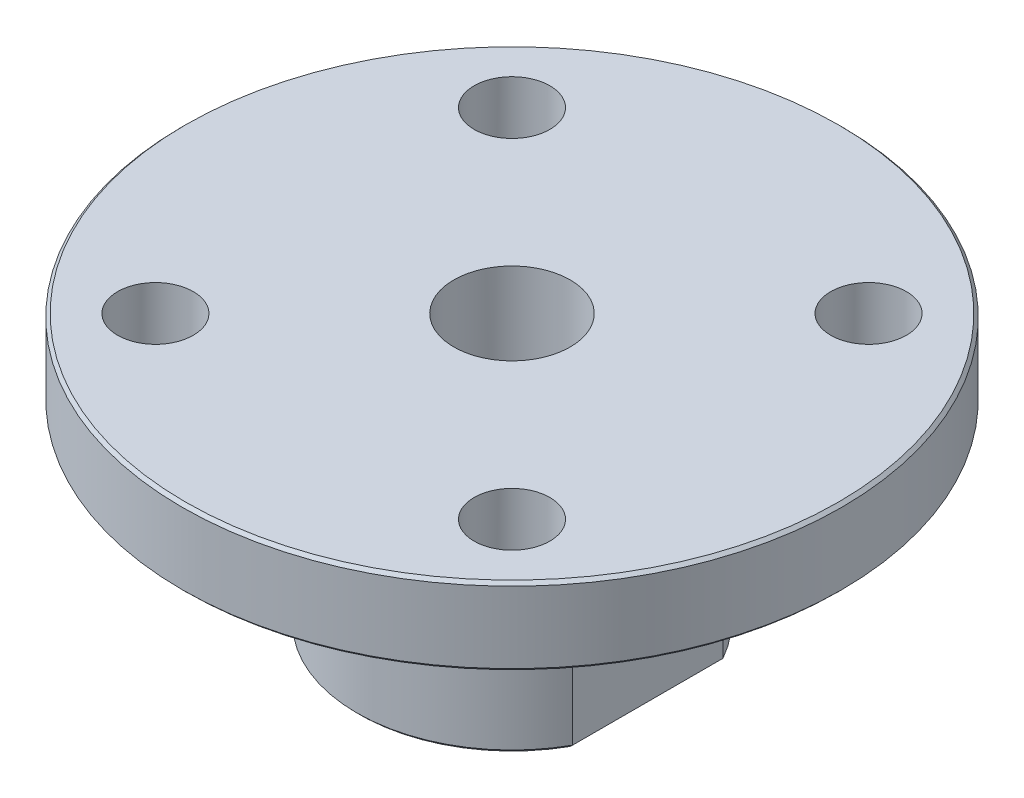
ISO-10303-21;
HEADER;
FILE_DESCRIPTION(('STEP AP214'),'2;1');
FILE_NAME('part.step','',(''),(''),'','','');
FILE_SCHEMA(('AUTOMOTIVE_DESIGN { 1 0 10303 214 1 1 1 1 }'));
ENDSEC;
DATA;
#1=APPLICATION_CONTEXT('core data for automotive mechanical design processes');
#2=APPLICATION_PROTOCOL_DEFINITION('international standard','automotive_design',2000,#1);
#3=PRODUCT_CONTEXT('',#1,'mechanical');
#4=PRODUCT('Part','Part','',(#3));
#5=PRODUCT_RELATED_PRODUCT_CATEGORY('part','',(#4));
#6=PRODUCT_DEFINITION_FORMATION('','',#4);
#7=PRODUCT_DEFINITION_CONTEXT('part definition',#1,'design');
#8=PRODUCT_DEFINITION('design','',#6,#7);
#9=PRODUCT_DEFINITION_SHAPE('','',#8);
#10=(LENGTH_UNIT() NAMED_UNIT(*) SI_UNIT(.MILLI.,.METRE.));
#11=(NAMED_UNIT(*) PLANE_ANGLE_UNIT() SI_UNIT($,.RADIAN.));
#12=(NAMED_UNIT(*) SI_UNIT($,.STERADIAN.) SOLID_ANGLE_UNIT());
#13=UNCERTAINTY_MEASURE_WITH_UNIT(LENGTH_MEASURE(1.E-05),#10,'distance_accuracy_value','');
#14=(GEOMETRIC_REPRESENTATION_CONTEXT(3) GLOBAL_UNCERTAINTY_ASSIGNED_CONTEXT((#13)) GLOBAL_UNIT_ASSIGNED_CONTEXT((#10,
#11,#12)) REPRESENTATION_CONTEXT('',''));
#15=CARTESIAN_POINT('',(0.,0.,0.));
#16=DIRECTION('',(0.,0.,1.));
#17=DIRECTION('',(1.,0.,0.));
#18=AXIS2_PLACEMENT_3D('',#15,#16,#17);
#19=CARTESIAN_POINT('',(-0.0198817220532782,-3.8664891042179,5.31383670073567E-07));
#20=DIRECTION('',(0.,-1.,0.));
#21=DIRECTION('',(0.,0.,-1.));
#22=AXIS2_PLACEMENT_3D('',#19,#20,#21);
#23=CYLINDRICAL_SURFACE('',#22,9.525);
#24=DIRECTION('',(0.,-1.,0.));
#25=VECTOR('',#24,1.);
#26=CARTESIAN_POINT('',(8.31449327794672,17.5647608957821,-4.61127026519453));
#27=LINE('',#26,#25);
#28=CARTESIAN_POINT('',(8.31449327794672,8.0397608957821,-4.61127026519454));
#29=VERTEX_POINT('',#28);
#30=CARTESIAN_POINT('',(8.31449327794672,-3.6759891042179,-4.61127026519453));
#31=VERTEX_POINT('',#30);
#32=EDGE_CURVE('E106',#29,#31,#27,.T.);
#33=ORIENTED_EDGE('',*,*,#32,.T.);
#34=CARTESIAN_POINT('',(-0.0198817220532782,-3.6759891042179,5.31383670073567E-07));
#35=DIRECTION('',(0.,-1.,0.));
#36=DIRECTION('',(0.,0.,-1.));
#37=AXIS2_PLACEMENT_3D('',#34,#35,#36);
#38=CIRCLE('',#37,9.525);
#39=CARTESIAN_POINT('',(-8.35425672205328,-3.6759891042179,-4.61127026519453));
#40=VERTEX_POINT('',#39);
#41=EDGE_CURVE('E59',#31,#40,#38,.F.);
#42=ORIENTED_EDGE('',*,*,#41,.T.);
#43=DIRECTION('',(0.,-1.,0.));
#44=VECTOR('',#43,1.);
#45=CARTESIAN_POINT('',(-8.35425672205328,17.5647608957821,-4.61127026519453));
#46=LINE('',#45,#44);
#47=CARTESIAN_POINT('',(-8.35425672205328,8.0397608957821,-4.61127026519453));
#48=VERTEX_POINT('',#47);
#49=EDGE_CURVE('E126',#48,#40,#46,.T.);
#50=ORIENTED_EDGE('',*,*,#49,.F.);
#51=CARTESIAN_POINT('',(-0.0198817220532782,8.0397608957821,5.31383670073567E-07));
#52=DIRECTION('',(0.,-1.,0.));
#53=DIRECTION('',(0.,0.,-1.));
#54=AXIS2_PLACEMENT_3D('',#51,#52,#53);
#55=CIRCLE('',#54,9.525);
#56=EDGE_CURVE('E123',#48,#29,#55,.T.);
#57=ORIENTED_EDGE('',*,*,#56,.T.);
#58=EDGE_LOOP('',(#33,#42,#50,#57));
#59=FACE_BOUND('',#58,.T.);
#60=ADVANCED_FACE('F37',(#59),#23,.T.);
#61=CARTESIAN_POINT('',(9.50511827794672,-3.8664891042179,5.31383670073567E-07));
#62=DIRECTION('',(0.,-1.,0.));
#63=DIRECTION('',(0.,0.,-1.));
#64=AXIS2_PLACEMENT_3D('',#61,#62,#63);
#65=PLANE('',#64);
#66=CARTESIAN_POINT('',(-0.0198817220532782,-3.8664891042179,5.31383670073567E-07));
#67=DIRECTION('',(0.,-1.,0.));
#68=DIRECTION('',(0.,0.,-1.));
#69=AXIS2_PLACEMENT_3D('',#66,#67,#68);
#70=CIRCLE('',#69,9.33450000000001);
#71=CARTESIAN_POINT('',(-8.16375672205328,-3.8664891042179,-4.5618182105629));
#72=VERTEX_POINT('',#71);
#73=CARTESIAN_POINT('',(8.12399327794673,-3.8664891042179,-4.5618182105629));
#74=VERTEX_POINT('',#73);
#75=EDGE_CURVE('E157',#72,#74,#70,.T.);
#76=ORIENTED_EDGE('',*,*,#75,.T.);
#77=DIRECTION('',(0.,0.,1.));
#78=VECTOR('',#77,1.);
#79=CARTESIAN_POINT('',(8.12399327794673,-3.8664891042179,4.61127132796188));
#80=LINE('',#79,#78);
#81=CARTESIAN_POINT('',(8.12399327794673,-3.8664891042179,4.56181927333024));
#82=VERTEX_POINT('',#81);
#83=EDGE_CURVE('E163',#74,#82,#80,.T.);
#84=ORIENTED_EDGE('',*,*,#83,.T.);
#85=CARTESIAN_POINT('',(-0.0198817220532782,-3.8664891042179,5.31383670073567E-07));
#86=DIRECTION('',(0.,-1.,0.));
#87=DIRECTION('',(0.,0.,-1.));
#88=AXIS2_PLACEMENT_3D('',#85,#86,#87);
#89=CIRCLE('',#88,9.33450000000001);
#90=CARTESIAN_POINT('',(-8.16375672205328,-3.8664891042179,4.56181927333024));
#91=VERTEX_POINT('',#90);
#92=EDGE_CURVE('E161',#82,#91,#89,.T.);
#93=ORIENTED_EDGE('',*,*,#92,.T.);
#94=DIRECTION('',(0.,0.,-1.));
#95=VECTOR('',#94,1.);
#96=CARTESIAN_POINT('',(-8.16375672205328,-3.8664891042179,-4.61127026519453));
#97=LINE('',#96,#95);
#98=EDGE_CURVE('E159',#91,#72,#97,.T.);
#99=ORIENTED_EDGE('',*,*,#98,.T.);
#100=EDGE_LOOP('',(#76,#84,#93,#99));
#101=FACE_BOUND('',#100,.T.);
#102=CARTESIAN_POINT('',(-0.0198817220532782,-3.8664891042179,5.31383670073567E-07));
#103=DIRECTION('',(0.,-1.,0.));
#104=DIRECTION('',(0.,0.,-1.));
#105=AXIS2_PLACEMENT_3D('',#102,#103,#104);
#106=CIRCLE('',#105,3.571875);
#107=CARTESIAN_POINT('',(-0.0198817220532782,-3.8664891042179,-3.57187446861633));
#108=VERTEX_POINT('',#107);
#109=EDGE_CURVE('E133',#108,#108,#106,.T.);
#110=ORIENTED_EDGE('',*,*,#109,.F.);
#111=EDGE_LOOP('',(#110));
#112=FACE_BOUND('',#111,.T.);
#113=ADVANCED_FACE('F224',(#101,#112),#65,.T.);
#114=CARTESIAN_POINT('',(-0.0198817220532782,-3.8664891042179,5.31383670073567E-07));
#115=DIRECTION('',(0.,-1.,0.));
#116=DIRECTION('',(0.,0.,-1.));
#117=AXIS2_PLACEMENT_3D('',#114,#115,#116);
#118=CYLINDRICAL_SURFACE('',#117,3.571875);
#119=CARTESIAN_POINT('',(-2.73146170715883,3.2772608957821,-2.32499946861633));
#120=CARTESIAN_POINT('',(-2.7314775624167,3.3915795025591,-2.32499003055001));
#121=CARTESIAN_POINT('',(-2.73882493715926,3.50597022268737,-2.31649511386127));
#122=CARTESIAN_POINT('',(-2.76683538108933,3.73072819000853,-2.28319242976851));
#123=CARTESIAN_POINT('',(-2.78752287192214,3.84108766490796,-2.25835474207934));
#124=CARTESIAN_POINT('',(-2.8386039395818,4.05387877141388,-2.1942511721876));
#125=CARTESIAN_POINT('',(-2.86890822049158,4.15637297089722,-2.1551175473839));
#126=CARTESIAN_POINT('',(-2.93565193970546,4.35319795649541,-2.06391953658588));
#127=CARTESIAN_POINT('',(-2.97209274242278,4.447526920049,-2.01185227366062));
#128=CARTESIAN_POINT('',(-3.0534466715899,4.64056871836579,-1.88734533935964));
#129=CARTESIAN_POINT('',(-3.09881739174505,4.73788358807819,-1.81303517137026));
#130=CARTESIAN_POINT('',(-3.18919680070623,4.91985803352869,-1.64998653998349));
#131=CARTESIAN_POINT('',(-3.23420512056504,5.00450595676177,-1.56123494644712));
#132=CARTESIAN_POINT('',(-3.32598720345202,5.17015479941209,-1.35721479349088));
#133=CARTESIAN_POINT('',(-3.37217858469218,5.2491195423414,-1.23998383345868));
#134=CARTESIAN_POINT('',(-3.4336704450067,5.35139067128632,-1.05293722386762));
#135=CARTESIAN_POINT('',(-3.45287270934683,5.3827914157772,-0.988702581182095));
#136=CARTESIAN_POINT('',(-3.48811761396113,5.43978243378651,-0.856894266052433));
#137=CARTESIAN_POINT('',(-3.50416253951705,5.46537691194643,-0.789323053261652));
#138=CARTESIAN_POINT('',(-3.53103517812485,5.50790493767738,-0.658819505412244));
#139=CARTESIAN_POINT('',(-3.54223860215931,5.52547425911578,-0.596170930228988));
#140=CARTESIAN_POINT('',(-3.5613900429483,5.55536253639776,-0.46917888250122));
#141=CARTESIAN_POINT('',(-3.56934001233527,5.5676846416543,-0.404836451316687));
#142=CARTESIAN_POINT('',(-3.58174662469287,5.58686470236922,-0.275049628485655));
#143=CARTESIAN_POINT('',(-3.58620575545805,5.59372654921403,-0.209606055621842));
#144=CARTESIAN_POINT('',(-3.59150571159487,5.60187678832828,-0.078250627117506));
#145=CARTESIAN_POINT('',(-3.59234700979559,5.60316590891984,-0.0123388337985067));
#146=CARTESIAN_POINT('',(-3.58966337349005,5.59904791957824,0.165959354426146));
#147=CARTESIAN_POINT('',(-3.5826279370355,5.58825752714634,0.278231652061616));
#148=CARTESIAN_POINT('',(-3.55848924438826,5.55086466561955,0.498904640997477));
#149=CARTESIAN_POINT('',(-3.54138523947942,5.52426102062245,0.607305043741169));
#150=CARTESIAN_POINT('',(-3.49860096055752,5.45659724404411,0.817492651067283));
#151=CARTESIAN_POINT('',(-3.47293201216006,5.41555619948858,0.919288377948152));
#152=CARTESIAN_POINT('',(-3.41493962694044,5.3205827178036,1.11457064949462));
#153=CARTESIAN_POINT('',(-3.38261487253598,5.26664772784979,1.2080555436948));
#154=CARTESIAN_POINT('',(-3.30898296196476,5.13966306189124,1.39701993702971));
#155=CARTESIAN_POINT('',(-3.2670550011657,5.06504519598542,1.49120136622184));
#156=CARTESIAN_POINT('',(-3.18066485673093,4.90286806525612,1.66652969479193));
#157=CARTESIAN_POINT('',(-3.13619888058189,4.81528910447443,1.74765635720306));
#158=CARTESIAN_POINT('',(-3.04190156088801,4.61476266093576,1.9066757096577));
#159=CARTESIAN_POINT('',(-2.99223458157571,4.4999782036633,1.98236739924084));
#160=CARTESIAN_POINT('',(-2.90066153683479,4.25647418124092,2.11324129922088));
#161=CARTESIAN_POINT('',(-2.85874183131543,4.12777975216982,2.1684597313779));
#162=CARTESIAN_POINT('',(-2.79961944839022,3.89619499905228,2.24342836100646));
#163=CARTESIAN_POINT('',(-2.77878603419455,3.79604932547118,2.26876830141193));
#164=CARTESIAN_POINT('',(-2.74777937217019,3.59173825391798,2.30596425440145));
#165=CARTESIAN_POINT('',(-2.73758914730089,3.48757953327043,2.31784174364133));
#166=CARTESIAN_POINT('',(-2.72942987920154,3.27774816678446,2.32737847078233));
#167=CARTESIAN_POINT('',(-2.73150339013331,3.17207152024864,2.32498820045764));
#168=CARTESIAN_POINT('',(-2.74762514463678,2.96289267309574,2.30604638080633));
#169=CARTESIAN_POINT('',(-2.76168337550628,2.85939235982658,2.2894830204915));
#170=CARTESIAN_POINT('',(-2.7989650038435,2.66095536009888,2.24405928349386));
#171=CARTESIAN_POINT('',(-2.82184443036412,2.56584499548183,2.21565750554084));
#172=CARTESIAN_POINT('',(-2.87418201406417,2.38161517533058,2.14781155369745));
#173=CARTESIAN_POINT('',(-2.90364233897123,2.29249770645116,2.10836374018901));
#174=CARTESIAN_POINT('',(-2.97284197189282,2.10403887983035,2.01061361998227));
#175=CARTESIAN_POINT('',(-3.01346212557842,2.00615658556342,1.95012598171708));
#176=CARTESIAN_POINT('',(-3.09674173227081,1.820805351551,1.81589649313645));
#177=CARTESIAN_POINT('',(-3.13940360397706,1.73334921355113,1.7421386220648));
#178=CARTESIAN_POINT('',(-3.23171407869964,1.55382307585212,1.56655204065197));
#179=CARTESIAN_POINT('',(-3.28109674088834,1.46419762599976,1.46205462977692));
#180=CARTESIAN_POINT('',(-3.37297038010698,1.30372290656741,1.2368630698638));
#181=CARTESIAN_POINT('',(-3.41546836472491,1.23285449790467,1.11618562137854));
#182=CARTESIAN_POINT('',(-3.48165974721088,1.12489712389935,0.886412698107493));
#183=CARTESIAN_POINT('',(-3.50740995714605,1.08389932387082,0.77974764338448));
#184=CARTESIAN_POINT('',(-3.5493818550096,1.01775563326971,0.559834323275614));
#185=CARTESIAN_POINT('',(-3.56561139404612,0.992596680123771,0.446591567055515));
#186=CARTESIAN_POINT('',(-3.58709524309648,0.959393544845475,0.216133661642464));
#187=CARTESIAN_POINT('',(-3.59230852821251,0.951413334870012,0.0989053100166196));
#188=CARTESIAN_POINT('',(-3.591111903638,0.95325135178691,-0.135358380914078));
#189=CARTESIAN_POINT('',(-3.58470184430736,0.963069807821077,-0.252393717714624));
#190=CARTESIAN_POINT('',(-3.56162538265198,0.998785413582548,-0.475589150449209));
#191=CARTESIAN_POINT('',(-3.54559823257946,1.02368125021565,-0.581980204389795));
#192=CARTESIAN_POINT('',(-3.50517206459548,1.08746873259919,-0.788765599438254));
#193=CARTESIAN_POINT('',(-3.48077171388295,1.12636260653008,-0.889158982880431));
#194=CARTESIAN_POINT('',(-3.42345997911043,1.21980242020666,-1.08879046765158));
#195=CARTESIAN_POINT('',(-3.39007768181263,1.27524282288371,-1.18747140079573));
#196=CARTESIAN_POINT('',(-3.31821041560466,1.39874331133318,-1.37454686428876));
#197=CARTESIAN_POINT('',(-3.27972181946135,1.46681238163739,-1.46293399789207));
#198=CARTESIAN_POINT('',(-3.19405794981018,1.62562906159314,-1.64138429039719));
#199=CARTESIAN_POINT('',(-3.14646215264324,1.71825706756085,-1.72957406866604));
#200=CARTESIAN_POINT('',(-3.05223995479504,1.91704198499948,-1.88990530160735));
#201=CARTESIAN_POINT('',(-3.0056140527365,2.02320566452391,-1.9620386779346));
#202=CARTESIAN_POINT('',(-2.9235328197567,2.23472715468224,-2.0812765328512));
#203=CARTESIAN_POINT('',(-2.88740879912004,2.33872645012006,-2.13032179835603));
#204=CARTESIAN_POINT('',(-2.824080144694,2.55513087230911,-2.21302766732342));
#205=CARTESIAN_POINT('',(-2.79685449587449,2.66751541272667,-2.24672459376489));
#206=CARTESIAN_POINT('',(-2.76174218999931,2.8632689142691,-2.28932353559164));
#207=CARTESIAN_POINT('',(-2.75049329365705,2.94508273097013,-2.30264794277704));
#208=CARTESIAN_POINT('',(-2.73534811247472,3.11033876593768,-2.3204883378288));
#209=CARTESIAN_POINT('',(-2.73145012897747,3.19378060349541,-2.32500636069241));
#210=CARTESIAN_POINT('',(-2.73146170715883,3.2772608957821,-2.32499946861633));
#211=B_SPLINE_CURVE_WITH_KNOTS('',3,(#119,#120,#121,#122,#123,#124,#125,#126,#127,#128,#129,
#130,#131,#132,#133,#134,#135,#136,#137,#138,#139,#140,#141,#142,#143,#144,#145,#146,#147,#148,
#149,#150,#151,#152,#153,#154,#155,#156,#157,#158,#159,#160,#161,#162,#163,#164,#165,#166,#167,
#168,#169,#170,#171,#172,#173,#174,#175,#176,#177,#178,#179,#180,#181,#182,#183,#184,#185,#186,
#187,#188,#189,#190,#191,#192,#193,#194,#195,#196,#197,#198,#199,#200,#201,#202,#203,#204,#205,
#206,#207,#208,#209,#210),.UNSPECIFIED.,.T.,.F.,(4,2,2,2,2,2,2,2,2,2,2,2,2,2,2,2,2,2,2,2,2,2,2,
2,2,2,2,2,2,2,2,2,2,2,2,2,2,2,2,2,2,2,2,2,2,4),(0.,0.342577058786246,0.68578305805359,
1.02589116412076,1.36607499096276,1.75632465391691,2.14693113490703,2.59028603394016,
2.81208469072516,3.03372221433681,3.2314985676722,3.42915604647737,3.62667253337827,
3.82416320527059,4.1613883096566,4.49863849385254,4.83544448034078,5.17231720510119,
5.55264181918894,5.93355043282716,6.37006526010087,6.80580406776713,7.12067299113983,
7.43503889381593,7.75049625900399,8.06621676340994,8.37070152551469,8.67528673224584,
9.04005364496139,9.40526392151594,9.84192173126061,10.2781322565468,10.6280621664841,
10.9777031037519,11.3286438373433,11.6795890890128,12.009452307041,12.3393680552967,
12.6920365757864,13.0449569674442,13.4527124298897,13.8606725821052,14.2209094210398,
14.5802892459182,14.8305113637395,15.080675652865),.UNSPECIFIED.);
#212=CARTESIAN_POINT('',(-2.73146170715883,3.2772608957821,-2.32499946861633));
#213=VERTEX_POINT('',#212);
#214=EDGE_CURVE('E118',#213,#213,#211,.T.);
#215=ORIENTED_EDGE('',*,*,#214,.F.);
#216=EDGE_LOOP('',(#215));
#217=FACE_BOUND('',#216,.T.);
#218=ORIENTED_EDGE('',*,*,#109,.T.);
#219=EDGE_LOOP('',(#218));
#220=FACE_BOUND('',#219,.T.);
#221=CARTESIAN_POINT('',(-0.0198817220532782,12.8022608957821,5.31383670073567E-07));
#222=DIRECTION('',(0.,-1.,0.));
#223=DIRECTION('',(0.,0.,-1.));
#224=AXIS2_PLACEMENT_3D('',#221,#222,#223);
#225=CIRCLE('',#224,3.571875);
#226=CARTESIAN_POINT('',(-0.0198817220532782,12.8022608957821,-3.57187446861633));
#227=VERTEX_POINT('',#226);
#228=EDGE_CURVE('E125',#227,#227,#225,.T.);
#229=ORIENTED_EDGE('',*,*,#228,.F.);
#230=EDGE_LOOP('',(#229));
#231=FACE_BOUND('',#230,.T.);
#232=ADVANCED_FACE('F243',(#217,#220,#231),#118,.F.);
#233=CARTESIAN_POINT('',(20.2207432779467,12.8022608957821,5.31383670073567E-07));
#234=DIRECTION('',(0.,1.,0.));
#235=DIRECTION('',(0.,0.,1.));
#236=AXIS2_PLACEMENT_3D('',#233,#234,#235);
#237=PLANE('',#236);
#238=CARTESIAN_POINT('',(-0.0198817220532782,12.8022608957821,5.31383670073567E-07));
#239=DIRECTION('',(0.,1.,0.));
#240=DIRECTION('',(0.,0.,1.));
#241=AXIS2_PLACEMENT_3D('',#238,#239,#240);
#242=CIRCLE('',#241,20.050125);
#243=CARTESIAN_POINT('',(-0.0198817220532782,12.8022608957821,20.0501255313837));
#244=VERTEX_POINT('',#243);
#245=EDGE_CURVE('E11',#244,#244,#242,.T.);
#246=ORIENTED_EDGE('',*,*,#245,.T.);
#247=EDGE_LOOP('',(#246));
#248=FACE_BOUND('',#247,.T.);
#249=CARTESIAN_POINT('',(-10.964568869606,12.8022608957821,10.9446876789367));
#250=DIRECTION('',(0.,1.,0.));
#251=DIRECTION('',(0.,0.,1.));
#252=AXIS2_PLACEMENT_3D('',#249,#250,#251);
#253=CIRCLE('',#252,2.325);
#254=CARTESIAN_POINT('',(-10.964568869606,12.8022608957821,13.2696876789367));
#255=VERTEX_POINT('',#254);
#256=EDGE_CURVE('E155',#255,#255,#253,.T.);
#257=ORIENTED_EDGE('',*,*,#256,.F.);
#258=EDGE_LOOP('',(#257));
#259=FACE_BOUND('',#258,.T.);
#260=CARTESIAN_POINT('',(10.9248054255001,12.8022608957821,10.9446876789364));
#261=DIRECTION('',(0.,1.,0.));
#262=DIRECTION('',(0.,0.,1.));
#263=AXIS2_PLACEMENT_3D('',#260,#261,#262);
#264=CIRCLE('',#263,2.325);
#265=CARTESIAN_POINT('',(10.9248054255001,12.8022608957821,13.2696876789364));
#266=VERTEX_POINT('',#265);
#267=EDGE_CURVE('E151',#266,#266,#264,.T.);
#268=ORIENTED_EDGE('',*,*,#267,.F.);
#269=EDGE_LOOP('',(#268));
#270=FACE_BOUND('',#269,.T.);
#271=CARTESIAN_POINT('',(10.9248054254997,12.8022608957821,-10.9446866161697));
#272=DIRECTION('',(0.,1.,0.));
#273=DIRECTION('',(0.,0.,1.));
#274=AXIS2_PLACEMENT_3D('',#271,#272,#273);
#275=CIRCLE('',#274,2.325);
#276=CARTESIAN_POINT('',(10.9248054254997,12.8022608957821,-8.61968661616969));
#277=VERTEX_POINT('',#276);
#278=EDGE_CURVE('E147',#277,#277,#275,.T.);
#279=ORIENTED_EDGE('',*,*,#278,.F.);
#280=EDGE_LOOP('',(#279));
#281=FACE_BOUND('',#280,.T.);
#282=CARTESIAN_POINT('',(-10.9645688696063,12.8022608957821,-10.9446866161693));
#283=DIRECTION('',(0.,1.,0.));
#284=DIRECTION('',(0.,0.,1.));
#285=AXIS2_PLACEMENT_3D('',#282,#283,#284);
#286=CIRCLE('',#285,2.325);
#287=CARTESIAN_POINT('',(-10.9645688696063,12.8022608957821,-8.61968661616934));
#288=VERTEX_POINT('',#287);
#289=EDGE_CURVE('E143',#288,#288,#286,.T.);
#290=ORIENTED_EDGE('',*,*,#289,.F.);
#291=EDGE_LOOP('',(#290));
#292=FACE_BOUND('',#291,.T.);
#293=ORIENTED_EDGE('',*,*,#228,.T.);
#294=EDGE_LOOP('',(#293));
#295=FACE_BOUND('',#294,.T.);
#296=ADVANCED_FACE('F251',(#248,#259,#270,#281,#292,#295),#237,.T.);
#297=CARTESIAN_POINT('',(-0.0198817220532782,-3.8664891042179,5.31383670073567E-07));
#298=DIRECTION('',(0.,-1.,0.));
#299=DIRECTION('',(0.,0.,-1.));
#300=AXIS2_PLACEMENT_3D('',#297,#298,#299);
#301=CYLINDRICAL_SURFACE('',#300,20.240625);
#302=CARTESIAN_POINT('',(-0.0198817220532782,8.23026089578209,5.31383670073567E-07));
#303=DIRECTION('',(0.,-1.,0.));
#304=DIRECTION('',(0.,0.,-1.));
#305=AXIS2_PLACEMENT_3D('',#302,#303,#304);
#306=CIRCLE('',#305,20.240625);
#307=CARTESIAN_POINT('',(-0.0198817220532782,8.23026089578209,-20.2406244686163));
#308=VERTEX_POINT('',#307);
#309=EDGE_CURVE('E51',#308,#308,#306,.F.);
#310=ORIENTED_EDGE('',*,*,#309,.T.);
#311=EDGE_LOOP('',(#310));
#312=FACE_BOUND('',#311,.T.);
#313=CARTESIAN_POINT('',(-0.0198817220532782,12.6117608957821,5.31383670073567E-07));
#314=DIRECTION('',(0.,1.,0.));
#315=DIRECTION('',(0.,0.,1.));
#316=AXIS2_PLACEMENT_3D('',#313,#314,#315);
#317=CIRCLE('',#316,20.240625);
#318=CARTESIAN_POINT('',(-0.0198817220532782,12.6117608957821,20.2406255313837));
#319=VERTEX_POINT('',#318);
#320=EDGE_CURVE('E172',#319,#319,#317,.F.);
#321=ORIENTED_EDGE('',*,*,#320,.T.);
#322=EDGE_LOOP('',(#321));
#323=FACE_BOUND('',#322,.T.);
#324=ADVANCED_FACE('F247',(#312,#323),#301,.T.);
#325=CARTESIAN_POINT('',(9.50511827794672,8.0397608957821,5.31383670073567E-07));
#326=DIRECTION('',(0.,-1.,0.));
#327=DIRECTION('',(0.,0.,-1.));
#328=AXIS2_PLACEMENT_3D('',#325,#326,#327);
#329=PLANE('',#328);
#330=CARTESIAN_POINT('',(-0.0198817220532782,8.0397608957821,5.31383670073567E-07));
#331=DIRECTION('',(0.,-1.,0.));
#332=DIRECTION('',(0.,0.,-1.));
#333=AXIS2_PLACEMENT_3D('',#330,#331,#332);
#334=CIRCLE('',#333,20.050125);
#335=CARTESIAN_POINT('',(-0.0198817220532782,8.0397608957821,-20.0501244686163));
#336=VERTEX_POINT('',#335);
#337=EDGE_CURVE('E169',#336,#336,#334,.T.);
#338=ORIENTED_EDGE('',*,*,#337,.T.);
#339=EDGE_LOOP('',(#338));
#340=FACE_BOUND('',#339,.T.);
#341=CARTESIAN_POINT('',(-10.964568869606,8.0397608957821,10.9446876789367));
#342=DIRECTION('',(0.,-1.,0.));
#343=DIRECTION('',(0.,0.,-1.));
#344=AXIS2_PLACEMENT_3D('',#341,#342,#343);
#345=CIRCLE('',#344,2.325);
#346=CARTESIAN_POINT('',(-10.964568869606,8.0397608957821,8.61968767893672));
#347=VERTEX_POINT('',#346);
#348=EDGE_CURVE('E152',#347,#347,#345,.T.);
#349=ORIENTED_EDGE('',*,*,#348,.F.);
#350=EDGE_LOOP('',(#349));
#351=FACE_BOUND('',#350,.T.);
#352=CARTESIAN_POINT('',(10.9248054255001,8.0397608957821,10.9446876789364));
#353=DIRECTION('',(0.,-1.,0.));
#354=DIRECTION('',(0.,0.,-1.));
#355=AXIS2_PLACEMENT_3D('',#352,#353,#354);
#356=CIRCLE('',#355,2.325);
#357=CARTESIAN_POINT('',(10.9248054255001,8.0397608957821,8.61968767893637));
#358=VERTEX_POINT('',#357);
#359=EDGE_CURVE('E148',#358,#358,#356,.T.);
#360=ORIENTED_EDGE('',*,*,#359,.F.);
#361=EDGE_LOOP('',(#360));
#362=FACE_BOUND('',#361,.T.);
#363=CARTESIAN_POINT('',(10.9248054254997,8.0397608957821,-10.9446866161697));
#364=DIRECTION('',(0.,-1.,0.));
#365=DIRECTION('',(0.,0.,-1.));
#366=AXIS2_PLACEMENT_3D('',#363,#364,#365);
#367=CIRCLE('',#366,2.325);
#368=CARTESIAN_POINT('',(10.9248054254997,8.0397608957821,-13.2696866161697));
#369=VERTEX_POINT('',#368);
#370=EDGE_CURVE('E144',#369,#369,#367,.T.);
#371=ORIENTED_EDGE('',*,*,#370,.F.);
#372=EDGE_LOOP('',(#371));
#373=FACE_BOUND('',#372,.T.);
#374=CARTESIAN_POINT('',(-10.9645688696063,8.0397608957821,-10.9446866161693));
#375=DIRECTION('',(0.,-1.,0.));
#376=DIRECTION('',(0.,0.,-1.));
#377=AXIS2_PLACEMENT_3D('',#374,#375,#376);
#378=CIRCLE('',#377,2.325);
#379=CARTESIAN_POINT('',(-10.9645688696063,8.0397608957821,-13.2696866161693));
#380=VERTEX_POINT('',#379);
#381=EDGE_CURVE('E140',#380,#380,#378,.T.);
#382=ORIENTED_EDGE('',*,*,#381,.F.);
#383=EDGE_LOOP('',(#382));
#384=FACE_BOUND('',#383,.T.);
#385=DIRECTION('',(0.,0.,1.));
#386=VECTOR('',#385,1.);
#387=CARTESIAN_POINT('',(8.31449327794672,8.0397608957821,-4.61127026519453));
#388=LINE('',#387,#386);
#389=CARTESIAN_POINT('',(8.31449327794672,8.03976089578211,4.61127132796188));
#390=VERTEX_POINT('',#389);
#391=EDGE_CURVE('E100',#29,#390,#388,.T.);
#392=ORIENTED_EDGE('',*,*,#391,.F.);
#393=ORIENTED_EDGE('',*,*,#56,.F.);
#394=DIRECTION('',(0.,0.,-1.));
#395=VECTOR('',#394,1.);
#396=CARTESIAN_POINT('',(-8.35425672205328,8.0397608957821,-4.61127026519453));
#397=LINE('',#396,#395);
#398=CARTESIAN_POINT('',(-8.35425672205328,8.0397608957821,4.61127132796188));
#399=VERTEX_POINT('',#398);
#400=EDGE_CURVE('E122',#399,#48,#397,.T.);
#401=ORIENTED_EDGE('',*,*,#400,.F.);
#402=EDGE_CURVE('E115',#390,#399,#55,.T.);
#403=ORIENTED_EDGE('',*,*,#402,.F.);
#404=EDGE_LOOP('',(#392,#393,#401,#403));
#405=FACE_BOUND('',#404,.T.);
#406=ADVANCED_FACE('F121',(#340,#351,#362,#373,#384,#405),#329,.T.);
#407=DIRECTION('',(0.,-1.,0.));
#408=VECTOR('',#407,1.);
#409=CARTESIAN_POINT('',(-8.35425672205328,17.5647608957821,4.61127132796188));
#410=LINE('',#409,#408);
#411=CARTESIAN_POINT('',(-8.35425672205328,-3.6759891042179,4.61127132796188));
#412=VERTEX_POINT('',#411);
#413=EDGE_CURVE('E111',#399,#412,#410,.T.);
#414=ORIENTED_EDGE('',*,*,#413,.T.);
#415=CARTESIAN_POINT('',(-0.0198817220532782,-3.6759891042179,5.31383670073567E-07));
#416=DIRECTION('',(0.,-1.,0.));
#417=DIRECTION('',(0.,0.,-1.));
#418=AXIS2_PLACEMENT_3D('',#415,#416,#417);
#419=CIRCLE('',#418,9.525);
#420=CARTESIAN_POINT('',(8.31449327794672,-3.6759891042179,4.61127132796188));
#421=VERTEX_POINT('',#420);
#422=EDGE_CURVE('E117',#412,#421,#419,.F.);
#423=ORIENTED_EDGE('',*,*,#422,.T.);
#424=DIRECTION('',(0.,-1.,0.));
#425=VECTOR('',#424,1.);
#426=CARTESIAN_POINT('',(8.31449327794672,17.5647608957821,4.61127132796188));
#427=LINE('',#426,#425);
#428=EDGE_CURVE('E104',#390,#421,#427,.T.);
#429=ORIENTED_EDGE('',*,*,#428,.F.);
#430=ORIENTED_EDGE('',*,*,#402,.T.);
#431=EDGE_LOOP('',(#414,#423,#429,#430));
#432=FACE_BOUND('',#431,.T.);
#433=ADVANCED_FACE('F114',(#432),#23,.T.);
#434=CARTESIAN_POINT('',(-8.35425672205328,17.5647608957821,-4.61127026519453));
#435=DIRECTION('',(1.,0.,0.));
#436=DIRECTION('',(0.,0.,-1.));
#437=AXIS2_PLACEMENT_3D('',#434,#435,#436);
#438=PLANE('',#437);
#439=CARTESIAN_POINT('',(-8.35425672205328,3.2772608957821,5.31383670073567E-07));
#440=DIRECTION('',(1.,0.,0.));
#441=DIRECTION('',(0.,0.,-1.));
#442=AXIS2_PLACEMENT_3D('',#439,#440,#441);
#443=CIRCLE('',#442,2.325);
#444=CARTESIAN_POINT('',(-8.35425672205328,3.2772608957821,-2.32499946861633));
#445=VERTEX_POINT('',#444);
#446=EDGE_CURVE('E137',#445,#445,#443,.T.);
#447=ORIENTED_EDGE('',*,*,#446,.T.);
#448=EDGE_LOOP('',(#447));
#449=FACE_BOUND('',#448,.T.);
#450=ORIENTED_EDGE('',*,*,#49,.T.);
#451=DIRECTION('',(0.,0.,1.));
#452=VECTOR('',#451,1.);
#453=CARTESIAN_POINT('',(-8.35425672205328,-3.67598910421791,4.61127132796188));
#454=LINE('',#453,#452);
#455=EDGE_CURVE('E66',#40,#412,#454,.T.);
#456=ORIENTED_EDGE('',*,*,#455,.T.);
#457=ORIENTED_EDGE('',*,*,#413,.F.);
#458=ORIENTED_EDGE('',*,*,#400,.T.);
#459=EDGE_LOOP('',(#450,#456,#457,#458));
#460=FACE_BOUND('',#459,.T.);
#461=ADVANCED_FACE('F228',(#449,#460),#438,.F.);
#462=CARTESIAN_POINT('',(8.31449327794672,17.5647608957821,-4.61127026519453));
#463=DIRECTION('',(-1.,0.,0.));
#464=DIRECTION('',(0.,0.,1.));
#465=AXIS2_PLACEMENT_3D('',#462,#463,#464);
#466=PLANE('',#465);
#467=ORIENTED_EDGE('',*,*,#428,.T.);
#468=DIRECTION('',(0.,0.,-1.));
#469=VECTOR('',#468,1.);
#470=CARTESIAN_POINT('',(8.31449327794672,-3.67598910421791,-4.61127026519453));
#471=LINE('',#470,#469);
#472=EDGE_CURVE('E136',#421,#31,#471,.T.);
#473=ORIENTED_EDGE('',*,*,#472,.T.);
#474=ORIENTED_EDGE('',*,*,#32,.F.);
#475=ORIENTED_EDGE('',*,*,#391,.T.);
#476=EDGE_LOOP('',(#467,#473,#474,#475));
#477=FACE_BOUND('',#476,.T.);
#478=ADVANCED_FACE('F102',(#477),#466,.F.);
#479=CARTESIAN_POINT('',(-20.2605067220533,3.2772608957821,5.31383670073567E-07));
#480=DIRECTION('',(1.,0.,0.));
#481=DIRECTION('',(0.,0.,-1.));
#482=AXIS2_PLACEMENT_3D('',#479,#480,#481);
#483=CYLINDRICAL_SURFACE('',#482,2.325);
#484=ORIENTED_EDGE('',*,*,#214,.T.);
#485=EDGE_LOOP('',(#484));
#486=FACE_BOUND('',#485,.T.);
#487=ORIENTED_EDGE('',*,*,#446,.F.);
#488=EDGE_LOOP('',(#487));
#489=FACE_BOUND('',#488,.T.);
#490=ADVANCED_FACE('F236',(#486,#489),#483,.F.);
#491=CARTESIAN_POINT('',(-10.9645688696063,-3.8664891042179,-10.9446866161693));
#492=DIRECTION('',(0.,1.,0.));
#493=DIRECTION('',(0.,0.,1.));
#494=AXIS2_PLACEMENT_3D('',#491,#492,#493);
#495=CYLINDRICAL_SURFACE('',#494,2.325);
#496=ORIENTED_EDGE('',*,*,#381,.T.);
#497=EDGE_LOOP('',(#496));
#498=FACE_BOUND('',#497,.T.);
#499=ORIENTED_EDGE('',*,*,#289,.T.);
#500=EDGE_LOOP('',(#499));
#501=FACE_BOUND('',#500,.T.);
#502=ADVANCED_FACE('F268',(#498,#501),#495,.F.);
#503=CARTESIAN_POINT('',(10.9248054254997,-3.8664891042179,-10.9446866161697));
#504=DIRECTION('',(0.,1.,0.));
#505=DIRECTION('',(0.,0.,1.));
#506=AXIS2_PLACEMENT_3D('',#503,#504,#505);
#507=CYLINDRICAL_SURFACE('',#506,2.325);
#508=ORIENTED_EDGE('',*,*,#370,.T.);
#509=EDGE_LOOP('',(#508));
#510=FACE_BOUND('',#509,.T.);
#511=ORIENTED_EDGE('',*,*,#278,.T.);
#512=EDGE_LOOP('',(#511));
#513=FACE_BOUND('',#512,.T.);
#514=ADVANCED_FACE('F272',(#510,#513),#507,.F.);
#515=CARTESIAN_POINT('',(10.9248054255001,-3.8664891042179,10.9446876789364));
#516=DIRECTION('',(0.,1.,0.));
#517=DIRECTION('',(0.,0.,1.));
#518=AXIS2_PLACEMENT_3D('',#515,#516,#517);
#519=CYLINDRICAL_SURFACE('',#518,2.325);
#520=ORIENTED_EDGE('',*,*,#359,.T.);
#521=EDGE_LOOP('',(#520));
#522=FACE_BOUND('',#521,.T.);
#523=ORIENTED_EDGE('',*,*,#267,.T.);
#524=EDGE_LOOP('',(#523));
#525=FACE_BOUND('',#524,.T.);
#526=ADVANCED_FACE('F276',(#522,#525),#519,.F.);
#527=CARTESIAN_POINT('',(-10.964568869606,-3.8664891042179,10.9446876789367));
#528=DIRECTION('',(0.,1.,0.));
#529=DIRECTION('',(0.,0.,1.));
#530=AXIS2_PLACEMENT_3D('',#527,#528,#529);
#531=CYLINDRICAL_SURFACE('',#530,2.325);
#532=ORIENTED_EDGE('',*,*,#348,.T.);
#533=EDGE_LOOP('',(#532));
#534=FACE_BOUND('',#533,.T.);
#535=ORIENTED_EDGE('',*,*,#256,.T.);
#536=EDGE_LOOP('',(#535));
#537=FACE_BOUND('',#536,.T.);
#538=ADVANCED_FACE('F205',(#534,#537),#531,.F.);
#539=CARTESIAN_POINT('',(-8.35425672205328,-3.67598910421791,-4.61127026519453));
#540=DIRECTION('',(-0.707106781186541,-0.707106781186554,0.));
#541=DIRECTION('',(0.707106781186554,-0.707106781186541,0.));
#542=AXIS2_PLACEMENT_3D('',#539,#540,#541);
#543=PLANE('',#542);
#544=CARTESIAN_POINT('',(-8.16375672205328,-3.8664891042179,-4.5618182105629));
#545=CARTESIAN_POINT('',(-8.19550114296527,-3.83474468330591,-4.57010320395843));
#546=CARTESIAN_POINT('',(-8.22724835345801,-3.80299747281317,-4.57836670521832));
#547=CARTESIAN_POINT('',(-8.29074835345804,-3.73949747281315,-4.59485072342867));
#548=CARTESIAN_POINT('',(-8.32250114296529,-3.70774468330589,-4.60307124037932));
#549=CARTESIAN_POINT('',(-8.35425672205328,-3.67598910421791,-4.61127026519453));
#550=B_SPLINE_CURVE_WITH_KNOTS('',3,(#544,#545,#546,#547,#548,#549),.UNSPECIFIED.,.F.,.F.,(4,2,
4),(0.,0.136954393178584,0.273908785723277),.UNSPECIFIED.);
#551=EDGE_CURVE('E208',#72,#40,#550,.T.);
#552=ORIENTED_EDGE('',*,*,#551,.F.);
#553=ORIENTED_EDGE('',*,*,#98,.F.);
#554=CARTESIAN_POINT('',(-8.16375672205328,-3.8664891042179,4.56181927333024));
#555=CARTESIAN_POINT('',(-8.19550114296527,-3.83474468330591,4.57010426672577));
#556=CARTESIAN_POINT('',(-8.22724835345801,-3.80299747281317,4.57836776798566));
#557=CARTESIAN_POINT('',(-8.29074835345804,-3.73949747281315,4.59485178619601));
#558=CARTESIAN_POINT('',(-8.3225011429653,-3.70774468330589,4.60307230314666));
#559=CARTESIAN_POINT('',(-8.35425672205328,-3.67598910421791,4.61127132796187));
#560=B_SPLINE_CURVE_WITH_KNOTS('',3,(#554,#555,#556,#557,#558,#559),.UNSPECIFIED.,.F.,.F.,(4,2,
4),(0.,0.136954393178583,0.273908785723277),.UNSPECIFIED.);
#561=EDGE_CURVE('E41',#412,#91,#560,.F.);
#562=ORIENTED_EDGE('',*,*,#561,.F.);
#563=ORIENTED_EDGE('',*,*,#455,.F.);
#564=EDGE_LOOP('',(#552,#553,#562,#563));
#565=FACE_BOUND('',#564,.T.);
#566=ADVANCED_FACE('F200',(#565),#543,.T.);
#567=CARTESIAN_POINT('',(-0.0198817220532782,-3.8664891042179,5.31383670073567E-07));
#568=DIRECTION('',(0.,1.,0.));
#569=DIRECTION('',(0.,0.,1.));
#570=AXIS2_PLACEMENT_3D('',#567,#568,#569);
#571=CONICAL_SURFACE('',#570,9.33450000000001,0.785398163397455);
#572=ORIENTED_EDGE('',*,*,#561,.T.);
#573=ORIENTED_EDGE('',*,*,#92,.F.);
#574=CARTESIAN_POINT('',(8.12399327794673,-3.8664891042179,4.56181927333024));
#575=CARTESIAN_POINT('',(8.15573769885872,-3.83474468330591,4.57010426672577));
#576=CARTESIAN_POINT('',(8.18748490935146,-3.80299747281317,4.57836776798566));
#577=CARTESIAN_POINT('',(8.25098490935148,-3.73949747281315,4.59485178619601));
#578=CARTESIAN_POINT('',(8.28273769885874,-3.70774468330589,4.60307230314666));
#579=CARTESIAN_POINT('',(8.31449327794672,-3.67598910421791,4.61127132796187));
#580=B_SPLINE_CURVE_WITH_KNOTS('',3,(#574,#575,#576,#577,#578,#579),.UNSPECIFIED.,.F.,.F.,(4,2,
4),(0.,0.136954393178583,0.273908785723277),.UNSPECIFIED.);
#581=EDGE_CURVE('E184',#421,#82,#580,.F.);
#582=ORIENTED_EDGE('',*,*,#581,.F.);
#583=ORIENTED_EDGE('',*,*,#422,.F.);
#584=EDGE_LOOP('',(#572,#573,#582,#583));
#585=FACE_BOUND('',#584,.T.);
#586=ADVANCED_FACE('F196',(#585),#571,.T.);
#587=CARTESIAN_POINT('',(-0.0198817220532782,-3.8664891042179,5.31383670073567E-07));
#588=DIRECTION('',(0.,1.,0.));
#589=DIRECTION('',(0.,0.,1.));
#590=AXIS2_PLACEMENT_3D('',#587,#588,#589);
#591=CONICAL_SURFACE('',#590,9.33450000000001,0.785398163397455);
#592=ORIENTED_EDGE('',*,*,#551,.T.);
#593=ORIENTED_EDGE('',*,*,#41,.F.);
#594=CARTESIAN_POINT('',(8.31449327794672,-3.67598910421791,-4.61127026519453));
#595=CARTESIAN_POINT('',(8.28273769885874,-3.70774468330589,-4.60307124037932));
#596=CARTESIAN_POINT('',(8.25098490935148,-3.73949747281315,-4.59485072342867));
#597=CARTESIAN_POINT('',(8.18748490935146,-3.80299747281317,-4.57836670521832));
#598=CARTESIAN_POINT('',(8.15573769885872,-3.83474468330591,-4.57010320395843));
#599=CARTESIAN_POINT('',(8.12399327794673,-3.8664891042179,-4.5618182105629));
#600=B_SPLINE_CURVE_WITH_KNOTS('',3,(#594,#595,#596,#597,#598,#599),.UNSPECIFIED.,.F.,.F.,(4,2,
4),(0.,0.136954392544693,0.273908785723275),.UNSPECIFIED.);
#601=EDGE_CURVE('E177',#74,#31,#600,.F.);
#602=ORIENTED_EDGE('',*,*,#601,.F.);
#603=ORIENTED_EDGE('',*,*,#75,.F.);
#604=EDGE_LOOP('',(#592,#593,#602,#603));
#605=FACE_BOUND('',#604,.T.);
#606=ADVANCED_FACE('F188',(#605),#591,.T.);
#607=CARTESIAN_POINT('',(8.31449327794672,-3.67598910421791,-4.61127026519453));
#608=DIRECTION('',(0.707106781186541,-0.707106781186554,0.));
#609=DIRECTION('',(0.707106781186554,0.707106781186541,0.));
#610=AXIS2_PLACEMENT_3D('',#607,#608,#609);
#611=PLANE('',#610);
#612=ORIENTED_EDGE('',*,*,#581,.T.);
#613=ORIENTED_EDGE('',*,*,#83,.F.);
#614=ORIENTED_EDGE('',*,*,#601,.T.);
#615=ORIENTED_EDGE('',*,*,#472,.F.);
#616=EDGE_LOOP('',(#612,#613,#614,#615));
#617=FACE_BOUND('',#616,.T.);
#618=ADVANCED_FACE('F191',(#617),#611,.T.);
#619=CARTESIAN_POINT('',(-0.0198817220532782,8.0397608957821,5.31383670073567E-07));
#620=DIRECTION('',(0.,1.,0.));
#621=DIRECTION('',(0.,0.,1.));
#622=AXIS2_PLACEMENT_3D('',#619,#620,#621);
#623=CONICAL_SURFACE('',#622,20.050125,0.785398163397482);
#624=ORIENTED_EDGE('',*,*,#309,.F.);
#625=EDGE_LOOP('',(#624));
#626=FACE_BOUND('',#625,.T.);
#627=ORIENTED_EDGE('',*,*,#337,.F.);
#628=EDGE_LOOP('',(#627));
#629=FACE_BOUND('',#628,.T.);
#630=ADVANCED_FACE('F194',(#626,#629),#623,.T.);
#631=CARTESIAN_POINT('',(-0.0198817220532782,12.6117608957821,5.31383670073567E-07));
#632=DIRECTION('',(0.,-1.,0.));
#633=DIRECTION('',(0.,0.,-1.));
#634=AXIS2_PLACEMENT_3D('',#631,#632,#633);
#635=CONICAL_SURFACE('',#634,20.240625,0.785398163397448);
#636=ORIENTED_EDGE('',*,*,#245,.F.);
#637=EDGE_LOOP('',(#636));
#638=FACE_BOUND('',#637,.T.);
#639=ORIENTED_EDGE('',*,*,#320,.F.);
#640=EDGE_LOOP('',(#639));
#641=FACE_BOUND('',#640,.T.);
#642=ADVANCED_FACE('F39',(#638,#641),#635,.T.);
#643=CLOSED_SHELL('',(#60,#113,#232,#296,#324,#406,#433,#461,#478,#490,#502,#514,#526,#538,#566,
#586,#606,#618,#630,#642));
#644=MANIFOLD_SOLID_BREP('B2',#643);
#645=ADVANCED_BREP_SHAPE_REPRESENTATION('',(#18,#644),#14);
#646=SHAPE_DEFINITION_REPRESENTATION(#9,#645);
ENDSEC;
END-ISO-10303-21;
